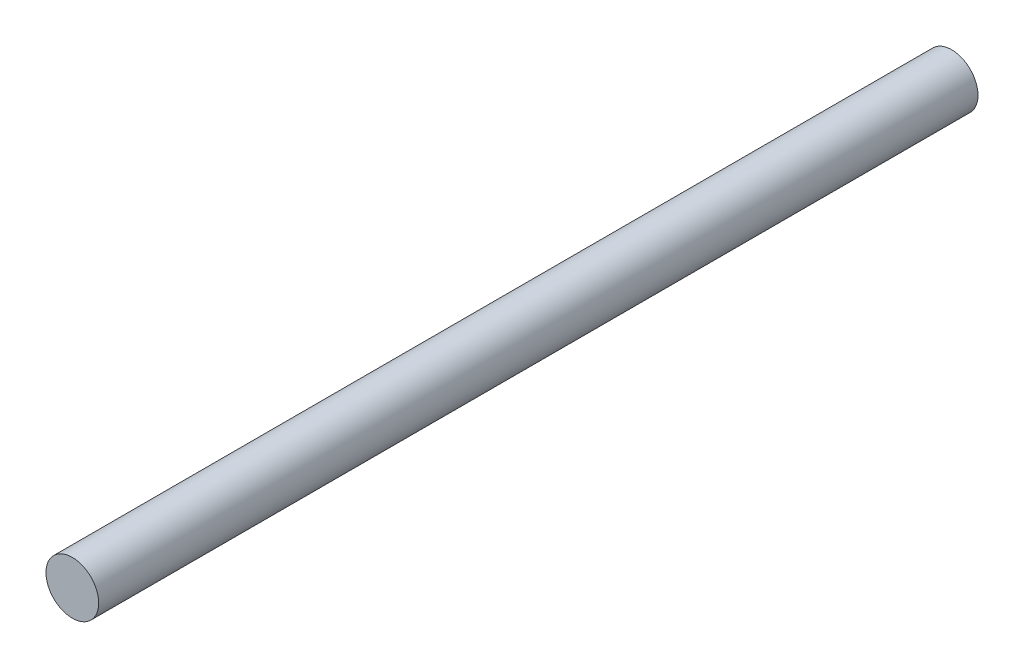
ISO-10303-21;
HEADER;
FILE_DESCRIPTION(('STEP AP214'),'2;1');
FILE_NAME('part.step','',(''),(''),'','','');
FILE_SCHEMA(('AUTOMOTIVE_DESIGN { 1 0 10303 214 1 1 1 1 }'));
ENDSEC;
DATA;
#1=APPLICATION_CONTEXT('core data for automotive mechanical design processes');
#2=APPLICATION_PROTOCOL_DEFINITION('international standard','automotive_design',2000,#1);
#3=PRODUCT_CONTEXT('',#1,'mechanical');
#4=PRODUCT('Part','Part','',(#3));
#5=PRODUCT_RELATED_PRODUCT_CATEGORY('part','',(#4));
#6=PRODUCT_DEFINITION_FORMATION('','',#4);
#7=PRODUCT_DEFINITION_CONTEXT('part definition',#1,'design');
#8=PRODUCT_DEFINITION('design','',#6,#7);
#9=PRODUCT_DEFINITION_SHAPE('','',#8);
#10=(LENGTH_UNIT() NAMED_UNIT(*) SI_UNIT(.MILLI.,.METRE.));
#11=(NAMED_UNIT(*) PLANE_ANGLE_UNIT() SI_UNIT($,.RADIAN.));
#12=(NAMED_UNIT(*) SI_UNIT($,.STERADIAN.) SOLID_ANGLE_UNIT());
#13=UNCERTAINTY_MEASURE_WITH_UNIT(LENGTH_MEASURE(1.E-05),#10,'distance_accuracy_value','');
#14=(GEOMETRIC_REPRESENTATION_CONTEXT(3) GLOBAL_UNCERTAINTY_ASSIGNED_CONTEXT((#13)) GLOBAL_UNIT_ASSIGNED_CONTEXT((#10,
#11,#12)) REPRESENTATION_CONTEXT('',''));
#15=CARTESIAN_POINT('',(0.,0.,0.));
#16=DIRECTION('',(0.,0.,1.));
#17=DIRECTION('',(1.,0.,0.));
#18=AXIS2_PLACEMENT_3D('',#15,#16,#17);
#19=CARTESIAN_POINT('',(0.,0.,200.));
#20=DIRECTION('',(0.,0.,-1.));
#21=DIRECTION('',(-1.,0.,0.));
#22=AXIS2_PLACEMENT_3D('',#19,#20,#21);
#23=CYLINDRICAL_SURFACE('',#22,6.);
#24=CARTESIAN_POINT('',(0.,0.,200.));
#25=DIRECTION('',(0.,0.,1.));
#26=DIRECTION('',(1.,0.,0.));
#27=AXIS2_PLACEMENT_3D('',#24,#25,#26);
#28=CIRCLE('',#27,6.);
#29=CARTESIAN_POINT('',(6.,0.,200.));
#30=VERTEX_POINT('',#29);
#31=EDGE_CURVE('E10',#30,#30,#28,.T.);
#32=ORIENTED_EDGE('',*,*,#31,.F.);
#33=EDGE_LOOP('',(#32));
#34=FACE_BOUND('',#33,.T.);
#35=CARTESIAN_POINT('',(0.,0.,0.));
#36=DIRECTION('',(0.,0.,1.));
#37=DIRECTION('',(1.,0.,0.));
#38=AXIS2_PLACEMENT_3D('',#35,#36,#37);
#39=CIRCLE('',#38,6.);
#40=CARTESIAN_POINT('',(6.,0.,0.));
#41=VERTEX_POINT('',#40);
#42=EDGE_CURVE('E38',#41,#41,#39,.T.);
#43=ORIENTED_EDGE('',*,*,#42,.T.);
#44=EDGE_LOOP('',(#43));
#45=FACE_BOUND('',#44,.T.);
#46=ADVANCED_FACE('F35',(#34,#45),#23,.T.);
#47=CARTESIAN_POINT('',(0.,0.,200.));
#48=DIRECTION('',(0.,0.,1.));
#49=DIRECTION('',(1.,0.,0.));
#50=AXIS2_PLACEMENT_3D('',#47,#48,#49);
#51=PLANE('',#50);
#52=ORIENTED_EDGE('',*,*,#31,.T.);
#53=EDGE_LOOP('',(#52));
#54=FACE_BOUND('',#53,.T.);
#55=ADVANCED_FACE('F50',(#54),#51,.T.);
#56=CARTESIAN_POINT('',(0.,0.,0.));
#57=DIRECTION('',(0.,0.,1.));
#58=DIRECTION('',(1.,0.,0.));
#59=AXIS2_PLACEMENT_3D('',#56,#57,#58);
#60=PLANE('',#59);
#61=ORIENTED_EDGE('',*,*,#42,.F.);
#62=EDGE_LOOP('',(#61));
#63=FACE_BOUND('',#62,.T.);
#64=ADVANCED_FACE('F48',(#63),#60,.F.);
#65=CLOSED_SHELL('',(#46,#55,#64));
#66=MANIFOLD_SOLID_BREP('B2',#65);
#67=ADVANCED_BREP_SHAPE_REPRESENTATION('',(#18,#66),#14);
#68=SHAPE_DEFINITION_REPRESENTATION(#9,#67);
ENDSEC;
END-ISO-10303-21;
